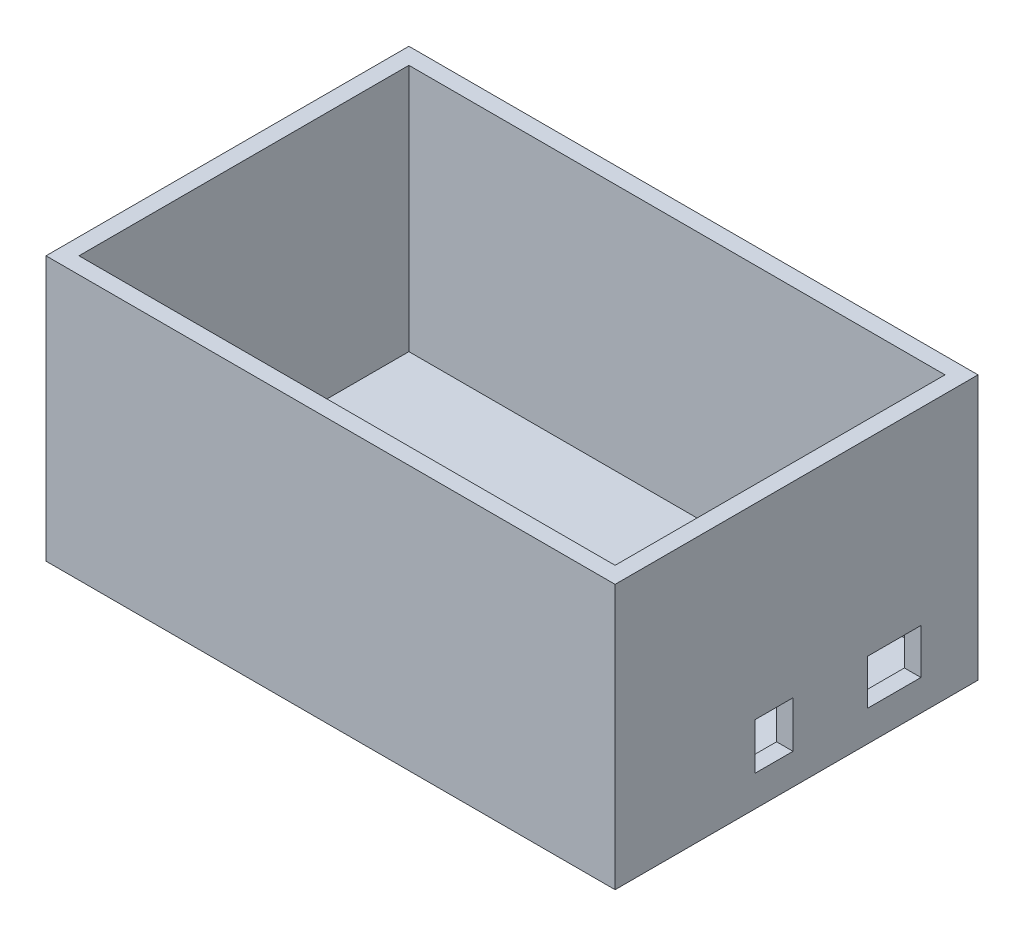
ISO-10303-21;
HEADER;
FILE_DESCRIPTION(('STEP AP214'),'2;1');
FILE_NAME('part.step','',(''),(''),'','','');
FILE_SCHEMA(('AUTOMOTIVE_DESIGN { 1 0 10303 214 1 1 1 1 }'));
ENDSEC;
DATA;
#1=APPLICATION_CONTEXT('core data for automotive mechanical design processes');
#2=APPLICATION_PROTOCOL_DEFINITION('international standard','automotive_design',2000,#1);
#3=PRODUCT_CONTEXT('',#1,'mechanical');
#4=PRODUCT('Part','Part','',(#3));
#5=PRODUCT_RELATED_PRODUCT_CATEGORY('part','',(#4));
#6=PRODUCT_DEFINITION_FORMATION('','',#4);
#7=PRODUCT_DEFINITION_CONTEXT('part definition',#1,'design');
#8=PRODUCT_DEFINITION('design','',#6,#7);
#9=PRODUCT_DEFINITION_SHAPE('','',#8);
#10=(LENGTH_UNIT() NAMED_UNIT(*) SI_UNIT(.MILLI.,.METRE.));
#11=(NAMED_UNIT(*) PLANE_ANGLE_UNIT() SI_UNIT($,.RADIAN.));
#12=(NAMED_UNIT(*) SI_UNIT($,.STERADIAN.) SOLID_ANGLE_UNIT());
#13=UNCERTAINTY_MEASURE_WITH_UNIT(LENGTH_MEASURE(1.E-05),#10,'distance_accuracy_value','');
#14=(GEOMETRIC_REPRESENTATION_CONTEXT(3) GLOBAL_UNCERTAINTY_ASSIGNED_CONTEXT((#13)) GLOBAL_UNIT_ASSIGNED_CONTEXT((#10,
#11,#12)) REPRESENTATION_CONTEXT('',''));
#15=CARTESIAN_POINT('',(0.,0.,0.));
#16=DIRECTION('',(0.,0.,1.));
#17=DIRECTION('',(1.,0.,0.));
#18=AXIS2_PLACEMENT_3D('',#15,#16,#17);
#19=CARTESIAN_POINT('',(98.3125,40.,56.885));
#20=DIRECTION('',(-1.,0.,0.));
#21=DIRECTION('',(0.,0.,1.));
#22=AXIS2_PLACEMENT_3D('',#19,#20,#21);
#23=PLANE('',#22);
#24=DIRECTION('',(0.,0.,-1.));
#25=VECTOR('',#24,1.);
#26=CARTESIAN_POINT('',(98.3125,-5.715,-17.272));
#27=LINE('',#26,#25);
#28=CARTESIAN_POINT('',(98.3125,-5.715,-4.31799999999998));
#29=VERTEX_POINT('',#28);
#30=CARTESIAN_POINT('',(98.3125,-5.715,-17.272));
#31=VERTEX_POINT('',#30);
#32=EDGE_CURVE('E191',#29,#31,#27,.T.);
#33=ORIENTED_EDGE('',*,*,#32,.T.);
#34=DIRECTION('',(0.,-1.,0.));
#35=VECTOR('',#34,1.);
#36=CARTESIAN_POINT('',(98.3125,-5.715,-17.272));
#37=LINE('',#36,#35);
#38=CARTESIAN_POINT('',(98.3125,-16.637,-17.272));
#39=VERTEX_POINT('',#38);
#40=EDGE_CURVE('E182',#31,#39,#37,.T.);
#41=ORIENTED_EDGE('',*,*,#40,.T.);
#42=DIRECTION('',(0.,0.,1.));
#43=VECTOR('',#42,1.);
#44=CARTESIAN_POINT('',(98.3125,-16.637,-17.272));
#45=LINE('',#44,#43);
#46=CARTESIAN_POINT('',(98.3125,-16.637,-4.31799999999998));
#47=VERTEX_POINT('',#46);
#48=EDGE_CURVE('E185',#39,#47,#45,.T.);
#49=ORIENTED_EDGE('',*,*,#48,.T.);
#50=DIRECTION('',(0.,1.,0.));
#51=VECTOR('',#50,1.);
#52=CARTESIAN_POINT('',(98.3125,-5.715,-4.31799999999998));
#53=LINE('',#52,#51);
#54=EDGE_CURVE('E188',#47,#29,#53,.T.);
#55=ORIENTED_EDGE('',*,*,#54,.T.);
#56=EDGE_LOOP('',(#33,#41,#49,#55));
#57=FACE_BOUND('',#56,.T.);
#58=DIRECTION('',(0.,-1.,0.));
#59=VECTOR('',#58,1.);
#60=CARTESIAN_POINT('',(98.3125,40.,56.885));
#61=LINE('',#60,#59);
#62=CARTESIAN_POINT('',(98.3125,40.,56.885));
#63=VERTEX_POINT('',#62);
#64=CARTESIAN_POINT('',(98.3125,-24.13,56.885));
#65=VERTEX_POINT('',#64);
#66=EDGE_CURVE('E265',#63,#65,#61,.T.);
#67=ORIENTED_EDGE('',*,*,#66,.T.);
#68=DIRECTION('',(0.,0.,-1.));
#69=VECTOR('',#68,1.);
#70=CARTESIAN_POINT('',(98.3125,-24.13,56.885));
#71=LINE('',#70,#69);
#72=CARTESIAN_POINT('',(98.3125,-24.13,-31.115));
#73=VERTEX_POINT('',#72);
#74=EDGE_CURVE('E225',#65,#73,#71,.T.);
#75=ORIENTED_EDGE('',*,*,#74,.T.);
#76=DIRECTION('',(0.,-1.,0.));
#77=VECTOR('',#76,1.);
#78=CARTESIAN_POINT('',(98.3125,40.,-31.115));
#79=LINE('',#78,#77);
#80=CARTESIAN_POINT('',(98.3125,40.,-31.115));
#81=VERTEX_POINT('',#80);
#82=EDGE_CURVE('E11',#81,#73,#79,.T.);
#83=ORIENTED_EDGE('',*,*,#82,.F.);
#84=DIRECTION('',(0.,0.,-1.));
#85=VECTOR('',#84,1.);
#86=CARTESIAN_POINT('',(98.3125,40.,56.885));
#87=LINE('',#86,#85);
#88=EDGE_CURVE('E256',#63,#81,#87,.T.);
#89=ORIENTED_EDGE('',*,*,#88,.F.);
#90=EDGE_LOOP('',(#67,#75,#83,#89));
#91=FACE_BOUND('',#90,.T.);
#92=DIRECTION('',(0.,0.,-1.));
#93=VECTOR('',#92,1.);
#94=CARTESIAN_POINT('',(98.3125,-5.383,13.733));
#95=LINE('',#94,#93);
#96=CARTESIAN_POINT('',(98.3125,-5.383,22.987));
#97=VERTEX_POINT('',#96);
#98=CARTESIAN_POINT('',(98.3125,-5.383,13.733));
#99=VERTEX_POINT('',#98);
#100=EDGE_CURVE('E162',#97,#99,#95,.T.);
#101=ORIENTED_EDGE('',*,*,#100,.T.);
#102=DIRECTION('',(0.,-1.,0.));
#103=VECTOR('',#102,1.);
#104=CARTESIAN_POINT('',(98.3125,-5.383,13.733));
#105=LINE('',#104,#103);
#106=CARTESIAN_POINT('',(98.3125,-16.637,13.733));
#107=VERTEX_POINT('',#106);
#108=EDGE_CURVE('E165',#99,#107,#105,.T.);
#109=ORIENTED_EDGE('',*,*,#108,.T.);
#110=DIRECTION('',(0.,0.,1.));
#111=VECTOR('',#110,1.);
#112=CARTESIAN_POINT('',(98.3125,-16.637,13.733));
#113=LINE('',#112,#111);
#114=CARTESIAN_POINT('',(98.3125,-16.637,22.987));
#115=VERTEX_POINT('',#114);
#116=EDGE_CURVE('E49',#107,#115,#113,.T.);
#117=ORIENTED_EDGE('',*,*,#116,.T.);
#118=DIRECTION('',(0.,1.,0.));
#119=VECTOR('',#118,1.);
#120=CARTESIAN_POINT('',(98.3125,-5.383,22.987));
#121=LINE('',#120,#119);
#122=EDGE_CURVE('E156',#115,#97,#121,.T.);
#123=ORIENTED_EDGE('',*,*,#122,.T.);
#124=EDGE_LOOP('',(#101,#109,#117,#123));
#125=FACE_BOUND('',#124,.T.);
#126=ADVANCED_FACE('F35',(#57,#91,#125),#23,.F.);
#127=CARTESIAN_POINT('',(94.3125,40.,56.885));
#128=DIRECTION('',(-1.,0.,0.));
#129=DIRECTION('',(0.,0.,1.));
#130=AXIS2_PLACEMENT_3D('',#127,#128,#129);
#131=PLANE('',#130);
#132=DIRECTION('',(0.,-1.,0.));
#133=VECTOR('',#132,1.);
#134=CARTESIAN_POINT('',(94.3125,40.,52.885));
#135=LINE('',#134,#133);
#136=CARTESIAN_POINT('',(94.3125,40.,52.885));
#137=VERTEX_POINT('',#136);
#138=CARTESIAN_POINT('',(94.3125,-20.13,52.885));
#139=VERTEX_POINT('',#138);
#140=EDGE_CURVE('E216',#137,#139,#135,.T.);
#141=ORIENTED_EDGE('',*,*,#140,.F.);
#142=DIRECTION('',(0.,0.,-1.));
#143=VECTOR('',#142,1.);
#144=CARTESIAN_POINT('',(94.3125,40.,-31.115));
#145=LINE('',#144,#143);
#146=CARTESIAN_POINT('',(94.3125,40.,-27.115));
#147=VERTEX_POINT('',#146);
#148=EDGE_CURVE('E237',#137,#147,#145,.T.);
#149=ORIENTED_EDGE('',*,*,#148,.T.);
#150=DIRECTION('',(0.,-1.,0.));
#151=VECTOR('',#150,1.);
#152=CARTESIAN_POINT('',(94.3125,40.,-27.115));
#153=LINE('',#152,#151);
#154=CARTESIAN_POINT('',(94.3125,-20.13,-27.115));
#155=VERTEX_POINT('',#154);
#156=EDGE_CURVE('E223',#147,#155,#153,.T.);
#157=ORIENTED_EDGE('',*,*,#156,.T.);
#158=DIRECTION('',(0.,0.,-1.));
#159=VECTOR('',#158,1.);
#160=CARTESIAN_POINT('',(94.3125,-20.13,-31.115));
#161=LINE('',#160,#159);
#162=EDGE_CURVE('E215',#139,#155,#161,.T.);
#163=ORIENTED_EDGE('',*,*,#162,.F.);
#164=EDGE_LOOP('',(#141,#149,#157,#163));
#165=FACE_BOUND('',#164,.T.);
#166=DIRECTION('',(0.,1.,0.));
#167=VECTOR('',#166,1.);
#168=CARTESIAN_POINT('',(94.3125,40.,-17.272));
#169=LINE('',#168,#167);
#170=CARTESIAN_POINT('',(94.3125,-16.637,-17.272));
#171=VERTEX_POINT('',#170);
#172=CARTESIAN_POINT('',(94.3125,-5.71500000000001,-17.272));
#173=VERTEX_POINT('',#172);
#174=EDGE_CURVE('E203',#171,#173,#169,.T.);
#175=ORIENTED_EDGE('',*,*,#174,.T.);
#176=DIRECTION('',(0.,0.,1.));
#177=VECTOR('',#176,1.);
#178=CARTESIAN_POINT('',(94.3125,-5.71500000000001,56.885));
#179=LINE('',#178,#177);
#180=CARTESIAN_POINT('',(94.3125,-5.715,-4.31799999999998));
#181=VERTEX_POINT('',#180);
#182=EDGE_CURVE('E212',#173,#181,#179,.T.);
#183=ORIENTED_EDGE('',*,*,#182,.T.);
#184=DIRECTION('',(0.,-1.,0.));
#185=VECTOR('',#184,1.);
#186=CARTESIAN_POINT('',(94.3125,40.,-4.31799999999999));
#187=LINE('',#186,#185);
#188=CARTESIAN_POINT('',(94.3125,-16.637,-4.31799999999998));
#189=VERTEX_POINT('',#188);
#190=EDGE_CURVE('E209',#181,#189,#187,.T.);
#191=ORIENTED_EDGE('',*,*,#190,.T.);
#192=DIRECTION('',(0.,0.,-1.));
#193=VECTOR('',#192,1.);
#194=CARTESIAN_POINT('',(94.3125,-16.637,56.885));
#195=LINE('',#194,#193);
#196=EDGE_CURVE('E206',#189,#171,#195,.T.);
#197=ORIENTED_EDGE('',*,*,#196,.T.);
#198=EDGE_LOOP('',(#175,#183,#191,#197));
#199=FACE_BOUND('',#198,.T.);
#200=DIRECTION('',(0.,1.,0.));
#201=VECTOR('',#200,1.);
#202=CARTESIAN_POINT('',(94.3125,40.,13.733));
#203=LINE('',#202,#201);
#204=CARTESIAN_POINT('',(94.3125,-16.637,13.733));
#205=VERTEX_POINT('',#204);
#206=CARTESIAN_POINT('',(94.3125,-5.38300000000001,13.733));
#207=VERTEX_POINT('',#206);
#208=EDGE_CURVE('E173',#205,#207,#203,.T.);
#209=ORIENTED_EDGE('',*,*,#208,.T.);
#210=DIRECTION('',(0.,0.,1.));
#211=VECTOR('',#210,1.);
#212=CARTESIAN_POINT('',(94.3125,-5.38300000000001,56.885));
#213=LINE('',#212,#211);
#214=CARTESIAN_POINT('',(94.3125,-5.383,22.987));
#215=VERTEX_POINT('',#214);
#216=EDGE_CURVE('E179',#207,#215,#213,.T.);
#217=ORIENTED_EDGE('',*,*,#216,.T.);
#218=DIRECTION('',(0.,-1.,0.));
#219=VECTOR('',#218,1.);
#220=CARTESIAN_POINT('',(94.3125,40.,22.987));
#221=LINE('',#220,#219);
#222=CARTESIAN_POINT('',(94.3125,-16.637,22.987));
#223=VERTEX_POINT('',#222);
#224=EDGE_CURVE('E177',#215,#223,#221,.T.);
#225=ORIENTED_EDGE('',*,*,#224,.T.);
#226=DIRECTION('',(0.,0.,-1.));
#227=VECTOR('',#226,1.);
#228=CARTESIAN_POINT('',(94.3125,-16.637,56.885));
#229=LINE('',#228,#227);
#230=EDGE_CURVE('E149',#223,#205,#229,.T.);
#231=ORIENTED_EDGE('',*,*,#230,.T.);
#232=EDGE_LOOP('',(#209,#217,#225,#231));
#233=FACE_BOUND('',#232,.T.);
#234=ADVANCED_FACE('F292',(#165,#199,#233),#131,.T.);
#235=CARTESIAN_POINT('',(98.3125,40.,-31.115));
#236=DIRECTION('',(0.,-1.,0.));
#237=DIRECTION('',(0.,0.,-1.));
#238=AXIS2_PLACEMENT_3D('',#235,#236,#237);
#239=PLANE('',#238);
#240=ORIENTED_EDGE('',*,*,#88,.T.);
#241=DIRECTION('',(-1.,0.,0.));
#242=VECTOR('',#241,1.);
#243=CARTESIAN_POINT('',(-39.6875,40.,-31.115));
#244=LINE('',#243,#242);
#245=CARTESIAN_POINT('',(-39.6875,40.,-31.115));
#246=VERTEX_POINT('',#245);
#247=EDGE_CURVE('E259',#81,#246,#244,.T.);
#248=ORIENTED_EDGE('',*,*,#247,.T.);
#249=DIRECTION('',(0.,0.,1.));
#250=VECTOR('',#249,1.);
#251=CARTESIAN_POINT('',(-39.6875,40.,56.885));
#252=LINE('',#251,#250);
#253=CARTESIAN_POINT('',(-39.6875,40.,56.885));
#254=VERTEX_POINT('',#253);
#255=EDGE_CURVE('E261',#246,#254,#252,.T.);
#256=ORIENTED_EDGE('',*,*,#255,.T.);
#257=DIRECTION('',(1.,0.,0.));
#258=VECTOR('',#257,1.);
#259=CARTESIAN_POINT('',(-39.6875,40.,56.885));
#260=LINE('',#259,#258);
#261=EDGE_CURVE('E263',#254,#63,#260,.T.);
#262=ORIENTED_EDGE('',*,*,#261,.T.);
#263=EDGE_LOOP('',(#240,#248,#256,#262));
#264=FACE_BOUND('',#263,.T.);
#265=ORIENTED_EDGE('',*,*,#148,.F.);
#266=DIRECTION('',(1.,0.,0.));
#267=VECTOR('',#266,1.);
#268=CARTESIAN_POINT('',(98.3125,40.,52.885));
#269=LINE('',#268,#267);
#270=CARTESIAN_POINT('',(-35.6875,40.,52.885));
#271=VERTEX_POINT('',#270);
#272=EDGE_CURVE('E219',#271,#137,#269,.T.);
#273=ORIENTED_EDGE('',*,*,#272,.F.);
#274=DIRECTION('',(0.,0.,1.));
#275=VECTOR('',#274,1.);
#276=CARTESIAN_POINT('',(-35.6875,40.,-31.115));
#277=LINE('',#276,#275);
#278=CARTESIAN_POINT('',(-35.6875,40.,-27.115));
#279=VERTEX_POINT('',#278);
#280=EDGE_CURVE('E241',#279,#271,#277,.T.);
#281=ORIENTED_EDGE('',*,*,#280,.F.);
#282=DIRECTION('',(-1.,0.,0.));
#283=VECTOR('',#282,1.);
#284=CARTESIAN_POINT('',(98.3125,40.,-27.115));
#285=LINE('',#284,#283);
#286=EDGE_CURVE('E239',#147,#279,#285,.T.);
#287=ORIENTED_EDGE('',*,*,#286,.F.);
#288=EDGE_LOOP('',(#265,#273,#281,#287));
#289=FACE_BOUND('',#288,.T.);
#290=ADVANCED_FACE('F289',(#264,#289),#239,.F.);
#291=CARTESIAN_POINT('',(-39.6875,40.,-31.115));
#292=DIRECTION('',(0.,0.,1.));
#293=DIRECTION('',(1.,0.,0.));
#294=AXIS2_PLACEMENT_3D('',#291,#292,#293);
#295=PLANE('',#294);
#296=ORIENTED_EDGE('',*,*,#82,.T.);
#297=DIRECTION('',(-1.,0.,0.));
#298=VECTOR('',#297,1.);
#299=CARTESIAN_POINT('',(-39.6875,-24.13,-31.115));
#300=LINE('',#299,#298);
#301=CARTESIAN_POINT('',(-39.6875,-24.13,-31.115));
#302=VERTEX_POINT('',#301);
#303=EDGE_CURVE('E247',#73,#302,#300,.T.);
#304=ORIENTED_EDGE('',*,*,#303,.T.);
#305=DIRECTION('',(0.,-1.,0.));
#306=VECTOR('',#305,1.);
#307=CARTESIAN_POINT('',(-39.6875,40.,-31.115));
#308=LINE('',#307,#306);
#309=EDGE_CURVE('E42',#246,#302,#308,.T.);
#310=ORIENTED_EDGE('',*,*,#309,.F.);
#311=ORIENTED_EDGE('',*,*,#247,.F.);
#312=EDGE_LOOP('',(#296,#304,#310,#311));
#313=FACE_BOUND('',#312,.T.);
#314=ADVANCED_FACE('F280',(#313),#295,.F.);
#315=CARTESIAN_POINT('',(-39.6875,40.,56.885));
#316=DIRECTION('',(1.,0.,0.));
#317=DIRECTION('',(0.,0.,-1.));
#318=AXIS2_PLACEMENT_3D('',#315,#316,#317);
#319=PLANE('',#318);
#320=ORIENTED_EDGE('',*,*,#309,.T.);
#321=DIRECTION('',(0.,0.,1.));
#322=VECTOR('',#321,1.);
#323=CARTESIAN_POINT('',(-39.6875,-24.13,56.885));
#324=LINE('',#323,#322);
#325=CARTESIAN_POINT('',(-39.6875,-24.13,56.885));
#326=VERTEX_POINT('',#325);
#327=EDGE_CURVE('E250',#302,#326,#324,.T.);
#328=ORIENTED_EDGE('',*,*,#327,.T.);
#329=DIRECTION('',(0.,-1.,0.));
#330=VECTOR('',#329,1.);
#331=CARTESIAN_POINT('',(-39.6875,40.,56.885));
#332=LINE('',#331,#330);
#333=EDGE_CURVE('E267',#254,#326,#332,.T.);
#334=ORIENTED_EDGE('',*,*,#333,.F.);
#335=ORIENTED_EDGE('',*,*,#255,.F.);
#336=EDGE_LOOP('',(#320,#328,#334,#335));
#337=FACE_BOUND('',#336,.T.);
#338=ADVANCED_FACE('F272',(#337),#319,.F.);
#339=CARTESIAN_POINT('',(-39.6875,40.,56.885));
#340=DIRECTION('',(0.,0.,-1.));
#341=DIRECTION('',(-1.,0.,0.));
#342=AXIS2_PLACEMENT_3D('',#339,#340,#341);
#343=PLANE('',#342);
#344=ORIENTED_EDGE('',*,*,#333,.T.);
#345=DIRECTION('',(1.,0.,0.));
#346=VECTOR('',#345,1.);
#347=CARTESIAN_POINT('',(-39.6875,-24.13,56.885));
#348=LINE('',#347,#346);
#349=EDGE_CURVE('E253',#326,#65,#348,.T.);
#350=ORIENTED_EDGE('',*,*,#349,.T.);
#351=ORIENTED_EDGE('',*,*,#66,.F.);
#352=ORIENTED_EDGE('',*,*,#261,.F.);
#353=EDGE_LOOP('',(#344,#350,#351,#352));
#354=FACE_BOUND('',#353,.T.);
#355=ADVANCED_FACE('F286',(#354),#343,.F.);
#356=CARTESIAN_POINT('',(98.3125,-24.13,-31.115));
#357=DIRECTION('',(0.,-1.,0.));
#358=DIRECTION('',(0.,0.,-1.));
#359=AXIS2_PLACEMENT_3D('',#356,#357,#358);
#360=PLANE('',#359);
#361=ORIENTED_EDGE('',*,*,#74,.F.);
#362=ORIENTED_EDGE('',*,*,#349,.F.);
#363=ORIENTED_EDGE('',*,*,#327,.F.);
#364=ORIENTED_EDGE('',*,*,#303,.F.);
#365=EDGE_LOOP('',(#361,#362,#363,#364));
#366=FACE_BOUND('',#365,.T.);
#367=ADVANCED_FACE('F279',(#366),#360,.T.);
#368=CARTESIAN_POINT('',(-39.6875,40.,-27.115));
#369=DIRECTION('',(0.,0.,1.));
#370=DIRECTION('',(1.,0.,0.));
#371=AXIS2_PLACEMENT_3D('',#368,#369,#370);
#372=PLANE('',#371);
#373=ORIENTED_EDGE('',*,*,#156,.F.);
#374=ORIENTED_EDGE('',*,*,#286,.T.);
#375=DIRECTION('',(0.,-1.,0.));
#376=VECTOR('',#375,1.);
#377=CARTESIAN_POINT('',(-35.6875,40.,-27.115));
#378=LINE('',#377,#376);
#379=CARTESIAN_POINT('',(-35.6875,-20.13,-27.115));
#380=VERTEX_POINT('',#379);
#381=EDGE_CURVE('E226',#279,#380,#378,.T.);
#382=ORIENTED_EDGE('',*,*,#381,.T.);
#383=DIRECTION('',(-1.,0.,0.));
#384=VECTOR('',#383,1.);
#385=CARTESIAN_POINT('',(98.3125,-20.13,-27.115));
#386=LINE('',#385,#384);
#387=EDGE_CURVE('E222',#155,#380,#386,.T.);
#388=ORIENTED_EDGE('',*,*,#387,.F.);
#389=EDGE_LOOP('',(#373,#374,#382,#388));
#390=FACE_BOUND('',#389,.T.);
#391=ADVANCED_FACE('F305',(#390),#372,.T.);
#392=CARTESIAN_POINT('',(-35.6875,40.,56.885));
#393=DIRECTION('',(1.,0.,0.));
#394=DIRECTION('',(0.,0.,-1.));
#395=AXIS2_PLACEMENT_3D('',#392,#393,#394);
#396=PLANE('',#395);
#397=ORIENTED_EDGE('',*,*,#381,.F.);
#398=ORIENTED_EDGE('',*,*,#280,.T.);
#399=DIRECTION('',(0.,-1.,0.));
#400=VECTOR('',#399,1.);
#401=CARTESIAN_POINT('',(-35.6875,40.,52.885));
#402=LINE('',#401,#400);
#403=CARTESIAN_POINT('',(-35.6875,-20.13,52.885));
#404=VERTEX_POINT('',#403);
#405=EDGE_CURVE('E218',#271,#404,#402,.T.);
#406=ORIENTED_EDGE('',*,*,#405,.T.);
#407=DIRECTION('',(0.,0.,1.));
#408=VECTOR('',#407,1.);
#409=CARTESIAN_POINT('',(-35.6875,-20.13,-31.115));
#410=LINE('',#409,#408);
#411=EDGE_CURVE('E229',#380,#404,#410,.T.);
#412=ORIENTED_EDGE('',*,*,#411,.F.);
#413=EDGE_LOOP('',(#397,#398,#406,#412));
#414=FACE_BOUND('',#413,.T.);
#415=ADVANCED_FACE('F314',(#414),#396,.T.);
#416=CARTESIAN_POINT('',(-39.6875,40.,52.885));
#417=DIRECTION('',(0.,0.,-1.));
#418=DIRECTION('',(-1.,0.,0.));
#419=AXIS2_PLACEMENT_3D('',#416,#417,#418);
#420=PLANE('',#419);
#421=ORIENTED_EDGE('',*,*,#405,.F.);
#422=ORIENTED_EDGE('',*,*,#272,.T.);
#423=ORIENTED_EDGE('',*,*,#140,.T.);
#424=DIRECTION('',(1.,0.,0.));
#425=VECTOR('',#424,1.);
#426=CARTESIAN_POINT('',(98.3125,-20.13,52.885));
#427=LINE('',#426,#425);
#428=EDGE_CURVE('E233',#404,#139,#427,.T.);
#429=ORIENTED_EDGE('',*,*,#428,.F.);
#430=EDGE_LOOP('',(#421,#422,#423,#429));
#431=FACE_BOUND('',#430,.T.);
#432=ADVANCED_FACE('F312',(#431),#420,.T.);
#433=CARTESIAN_POINT('',(98.3125,-20.13,-31.115));
#434=DIRECTION('',(0.,-1.,0.));
#435=DIRECTION('',(0.,0.,-1.));
#436=AXIS2_PLACEMENT_3D('',#433,#434,#435);
#437=PLANE('',#436);
#438=ORIENTED_EDGE('',*,*,#162,.T.);
#439=ORIENTED_EDGE('',*,*,#387,.T.);
#440=ORIENTED_EDGE('',*,*,#411,.T.);
#441=ORIENTED_EDGE('',*,*,#428,.T.);
#442=EDGE_LOOP('',(#438,#439,#440,#441));
#443=FACE_BOUND('',#442,.T.);
#444=ADVANCED_FACE('F309',(#443),#437,.F.);
#445=CARTESIAN_POINT('',(-52.6314133614405,-5.715,-17.272));
#446=DIRECTION('',(0.,-1.,0.));
#447=DIRECTION('',(0.,0.,-1.));
#448=AXIS2_PLACEMENT_3D('',#445,#446,#447);
#449=PLANE('',#448);
#450=DIRECTION('',(1.,0.,0.));
#451=VECTOR('',#450,1.);
#452=CARTESIAN_POINT('',(-52.6314133614405,-5.715,-17.272));
#453=LINE('',#452,#451);
#454=EDGE_CURVE('E194',#173,#31,#453,.T.);
#455=ORIENTED_EDGE('',*,*,#454,.T.);
#456=ORIENTED_EDGE('',*,*,#32,.F.);
#457=DIRECTION('',(1.,0.,0.));
#458=VECTOR('',#457,1.);
#459=CARTESIAN_POINT('',(-52.6314133614405,-5.715,-4.31799999999998));
#460=LINE('',#459,#458);
#461=EDGE_CURVE('E196',#181,#29,#460,.T.);
#462=ORIENTED_EDGE('',*,*,#461,.F.);
#463=ORIENTED_EDGE('',*,*,#182,.F.);
#464=EDGE_LOOP('',(#455,#456,#462,#463));
#465=FACE_BOUND('',#464,.T.);
#466=ADVANCED_FACE('F334',(#465),#449,.T.);
#467=CARTESIAN_POINT('',(-52.6314133614405,-5.715,-4.31799999999998));
#468=DIRECTION('',(0.,0.,-1.));
#469=DIRECTION('',(0.,1.,0.));
#470=AXIS2_PLACEMENT_3D('',#467,#468,#469);
#471=PLANE('',#470);
#472=ORIENTED_EDGE('',*,*,#461,.T.);
#473=ORIENTED_EDGE('',*,*,#54,.F.);
#474=DIRECTION('',(1.,0.,0.));
#475=VECTOR('',#474,1.);
#476=CARTESIAN_POINT('',(-52.6314133614405,-16.637,-4.31799999999998));
#477=LINE('',#476,#475);
#478=EDGE_CURVE('E198',#189,#47,#477,.T.);
#479=ORIENTED_EDGE('',*,*,#478,.F.);
#480=ORIENTED_EDGE('',*,*,#190,.F.);
#481=EDGE_LOOP('',(#472,#473,#479,#480));
#482=FACE_BOUND('',#481,.T.);
#483=ADVANCED_FACE('F344',(#482),#471,.T.);
#484=CARTESIAN_POINT('',(-52.6314133614405,-16.637,-17.272));
#485=DIRECTION('',(0.,1.,0.));
#486=DIRECTION('',(0.,0.,1.));
#487=AXIS2_PLACEMENT_3D('',#484,#485,#486);
#488=PLANE('',#487);
#489=ORIENTED_EDGE('',*,*,#478,.T.);
#490=ORIENTED_EDGE('',*,*,#48,.F.);
#491=DIRECTION('',(1.,0.,0.));
#492=VECTOR('',#491,1.);
#493=CARTESIAN_POINT('',(-52.6314133614405,-16.637,-17.272));
#494=LINE('',#493,#492);
#495=EDGE_CURVE('E200',#171,#39,#494,.T.);
#496=ORIENTED_EDGE('',*,*,#495,.F.);
#497=ORIENTED_EDGE('',*,*,#196,.F.);
#498=EDGE_LOOP('',(#489,#490,#496,#497));
#499=FACE_BOUND('',#498,.T.);
#500=ADVANCED_FACE('F340',(#499),#488,.T.);
#501=CARTESIAN_POINT('',(-52.6314133614405,-5.715,-17.272));
#502=DIRECTION('',(0.,0.,1.));
#503=DIRECTION('',(1.,0.,0.));
#504=AXIS2_PLACEMENT_3D('',#501,#502,#503);
#505=PLANE('',#504);
#506=ORIENTED_EDGE('',*,*,#495,.T.);
#507=ORIENTED_EDGE('',*,*,#40,.F.);
#508=ORIENTED_EDGE('',*,*,#454,.F.);
#509=ORIENTED_EDGE('',*,*,#174,.F.);
#510=EDGE_LOOP('',(#506,#507,#508,#509));
#511=FACE_BOUND('',#510,.T.);
#512=ADVANCED_FACE('F337',(#511),#505,.T.);
#513=CARTESIAN_POINT('',(-50.2576417975255,-5.383,13.733));
#514=DIRECTION('',(0.,-1.,0.));
#515=DIRECTION('',(0.,0.,-1.));
#516=AXIS2_PLACEMENT_3D('',#513,#514,#515);
#517=PLANE('',#516);
#518=DIRECTION('',(1.,0.,0.));
#519=VECTOR('',#518,1.);
#520=CARTESIAN_POINT('',(-50.2576417975255,-5.383,13.733));
#521=LINE('',#520,#519);
#522=EDGE_CURVE('E57',#207,#99,#521,.T.);
#523=ORIENTED_EDGE('',*,*,#522,.T.);
#524=ORIENTED_EDGE('',*,*,#100,.F.);
#525=DIRECTION('',(1.,0.,0.));
#526=VECTOR('',#525,1.);
#527=CARTESIAN_POINT('',(-50.2576417975255,-5.383,22.987));
#528=LINE('',#527,#526);
#529=EDGE_CURVE('E153',#215,#97,#528,.T.);
#530=ORIENTED_EDGE('',*,*,#529,.F.);
#531=ORIENTED_EDGE('',*,*,#216,.F.);
#532=EDGE_LOOP('',(#523,#524,#530,#531));
#533=FACE_BOUND('',#532,.T.);
#534=ADVANCED_FACE('F356',(#533),#517,.T.);
#535=CARTESIAN_POINT('',(-50.2576417975255,-5.383,22.987));
#536=DIRECTION('',(0.,0.,-1.));
#537=DIRECTION('',(0.,1.,0.));
#538=AXIS2_PLACEMENT_3D('',#535,#536,#537);
#539=PLANE('',#538);
#540=ORIENTED_EDGE('',*,*,#529,.T.);
#541=ORIENTED_EDGE('',*,*,#122,.F.);
#542=DIRECTION('',(1.,0.,0.));
#543=VECTOR('',#542,1.);
#544=CARTESIAN_POINT('',(-50.2576417975255,-16.637,22.987));
#545=LINE('',#544,#543);
#546=EDGE_CURVE('E145',#223,#115,#545,.T.);
#547=ORIENTED_EDGE('',*,*,#546,.F.);
#548=ORIENTED_EDGE('',*,*,#224,.F.);
#549=EDGE_LOOP('',(#540,#541,#547,#548));
#550=FACE_BOUND('',#549,.T.);
#551=ADVANCED_FACE('F157',(#550),#539,.T.);
#552=CARTESIAN_POINT('',(-50.2576417975255,-16.637,13.733));
#553=DIRECTION('',(0.,1.,0.));
#554=DIRECTION('',(0.,0.,1.));
#555=AXIS2_PLACEMENT_3D('',#552,#553,#554);
#556=PLANE('',#555);
#557=ORIENTED_EDGE('',*,*,#546,.T.);
#558=ORIENTED_EDGE('',*,*,#116,.F.);
#559=DIRECTION('',(1.,0.,0.));
#560=VECTOR('',#559,1.);
#561=CARTESIAN_POINT('',(-50.2576417975255,-16.637,13.733));
#562=LINE('',#561,#560);
#563=EDGE_CURVE('E152',#205,#107,#562,.T.);
#564=ORIENTED_EDGE('',*,*,#563,.F.);
#565=ORIENTED_EDGE('',*,*,#230,.F.);
#566=EDGE_LOOP('',(#557,#558,#564,#565));
#567=FACE_BOUND('',#566,.T.);
#568=ADVANCED_FACE('F147',(#567),#556,.T.);
#569=CARTESIAN_POINT('',(-50.2576417975255,-5.383,13.733));
#570=DIRECTION('',(0.,0.,1.));
#571=DIRECTION('',(0.,-1.,0.));
#572=AXIS2_PLACEMENT_3D('',#569,#570,#571);
#573=PLANE('',#572);
#574=ORIENTED_EDGE('',*,*,#563,.T.);
#575=ORIENTED_EDGE('',*,*,#108,.F.);
#576=ORIENTED_EDGE('',*,*,#522,.F.);
#577=ORIENTED_EDGE('',*,*,#208,.F.);
#578=EDGE_LOOP('',(#574,#575,#576,#577));
#579=FACE_BOUND('',#578,.T.);
#580=ADVANCED_FACE('F368',(#579),#573,.T.);
#581=CLOSED_SHELL('',(#126,#234,#290,#314,#338,#355,#367,#391,#415,#432,#444,#466,#483,#500,
#512,#534,#551,#568,#580));
#582=MANIFOLD_SOLID_BREP('B2',#581);
#583=ADVANCED_BREP_SHAPE_REPRESENTATION('',(#18,#582),#14);
#584=SHAPE_DEFINITION_REPRESENTATION(#9,#583);
ENDSEC;
END-ISO-10303-21;
